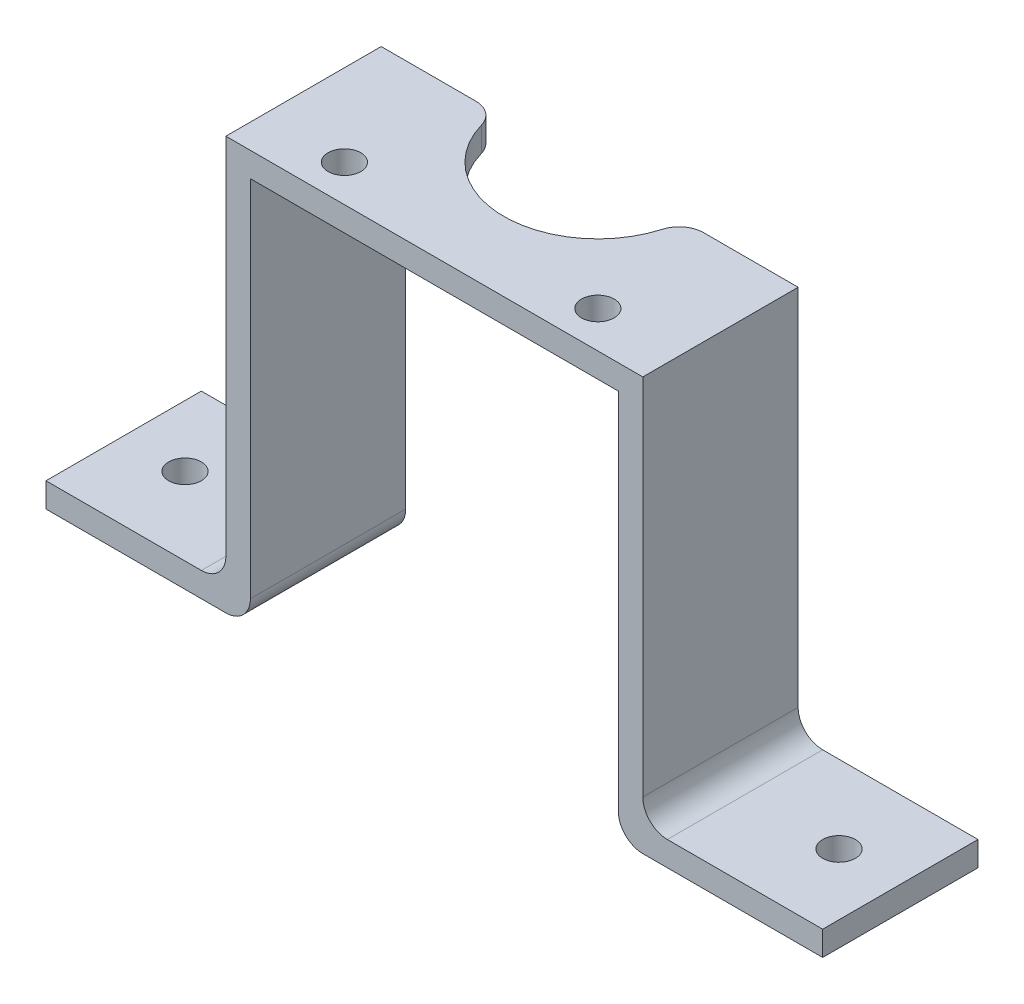
ISO-10303-21;
HEADER;
FILE_DESCRIPTION(('STEP AP214'),'2;1');
FILE_NAME('part.step','',(''),(''),'','','');
FILE_SCHEMA(('AUTOMOTIVE_DESIGN { 1 0 10303 214 1 1 1 1 }'));
ENDSEC;
DATA;
#1=APPLICATION_CONTEXT('core data for automotive mechanical design processes');
#2=APPLICATION_PROTOCOL_DEFINITION('international standard','automotive_design',2000,#1);
#3=PRODUCT_CONTEXT('',#1,'mechanical');
#4=PRODUCT('Part','Part','',(#3));
#5=PRODUCT_RELATED_PRODUCT_CATEGORY('part','',(#4));
#6=PRODUCT_DEFINITION_FORMATION('','',#4);
#7=PRODUCT_DEFINITION_CONTEXT('part definition',#1,'design');
#8=PRODUCT_DEFINITION('design','',#6,#7);
#9=PRODUCT_DEFINITION_SHAPE('','',#8);
#10=(LENGTH_UNIT() NAMED_UNIT(*) SI_UNIT(.MILLI.,.METRE.));
#11=(NAMED_UNIT(*) PLANE_ANGLE_UNIT() SI_UNIT($,.RADIAN.));
#12=(NAMED_UNIT(*) SI_UNIT($,.STERADIAN.) SOLID_ANGLE_UNIT());
#13=UNCERTAINTY_MEASURE_WITH_UNIT(LENGTH_MEASURE(1.E-05),#10,'distance_accuracy_value','');
#14=(GEOMETRIC_REPRESENTATION_CONTEXT(3) GLOBAL_UNCERTAINTY_ASSIGNED_CONTEXT((#13)) GLOBAL_UNIT_ASSIGNED_CONTEXT((#10,
#11,#12)) REPRESENTATION_CONTEXT('',''));
#15=CARTESIAN_POINT('',(0.,0.,0.));
#16=DIRECTION('',(0.,0.,1.));
#17=DIRECTION('',(1.,0.,0.));
#18=AXIS2_PLACEMENT_3D('',#15,#16,#17);
#19=CARTESIAN_POINT('',(0.,0.,-14.5));
#20=DIRECTION('',(0.,0.,1.));
#21=DIRECTION('',(1.,0.,0.));
#22=AXIS2_PLACEMENT_3D('',#19,#20,#21);
#23=PLANE('',#22);
#24=DIRECTION('',(-1.,0.,0.));
#25=VECTOR('',#24,1.);
#26=CARTESIAN_POINT('',(47.5,0.,-14.5));
#27=LINE('',#26,#25);
#28=CARTESIAN_POINT('',(47.5,0.,-14.5));
#29=VERTEX_POINT('',#28);
#30=CARTESIAN_POINT('',(25.5,0.,-14.5));
#31=VERTEX_POINT('',#30);
#32=EDGE_CURVE('E224',#29,#31,#27,.T.);
#33=ORIENTED_EDGE('',*,*,#32,.T.);
#34=CARTESIAN_POINT('',(25.5,3.,-14.5));
#35=DIRECTION('',(0.,0.,1.));
#36=DIRECTION('',(1.,0.,0.));
#37=AXIS2_PLACEMENT_3D('',#34,#35,#36);
#38=CIRCLE('',#37,3.);
#39=CARTESIAN_POINT('',(22.5,3.,-14.5));
#40=VERTEX_POINT('',#39);
#41=EDGE_CURVE('E175',#31,#40,#38,.F.);
#42=ORIENTED_EDGE('',*,*,#41,.T.);
#43=DIRECTION('',(0.,1.,0.));
#44=VECTOR('',#43,1.);
#45=CARTESIAN_POINT('',(22.5,0.,-14.5));
#46=LINE('',#45,#44);
#47=CARTESIAN_POINT('',(22.5,47.5,-14.5));
#48=VERTEX_POINT('',#47);
#49=EDGE_CURVE('E168',#40,#48,#46,.T.);
#50=ORIENTED_EDGE('',*,*,#49,.T.);
#51=DIRECTION('',(-1.,0.,0.));
#52=VECTOR('',#51,1.);
#53=CARTESIAN_POINT('',(22.5,47.5,-14.5));
#54=LINE('',#53,#52);
#55=CARTESIAN_POINT('',(13.9373598647664,47.5,-14.5));
#56=VERTEX_POINT('',#55);
#57=EDGE_CURVE('E173',#48,#56,#54,.T.);
#58=ORIENTED_EDGE('',*,*,#57,.T.);
#59=DIRECTION('',(0.,1.,0.));
#60=VECTOR('',#59,1.);
#61=CARTESIAN_POINT('',(13.9373598647663,0.,-14.5));
#62=LINE('',#61,#60);
#63=CARTESIAN_POINT('',(13.9373598647663,50.5,-14.5));
#64=VERTEX_POINT('',#63);
#65=EDGE_CURVE('E298',#56,#64,#62,.T.);
#66=ORIENTED_EDGE('',*,*,#65,.T.);
#67=DIRECTION('',(1.,0.,0.));
#68=VECTOR('',#67,1.);
#69=CARTESIAN_POINT('',(-25.5,50.5,-14.5));
#70=LINE('',#69,#68);
#71=CARTESIAN_POINT('',(25.5,50.5,-14.5));
#72=VERTEX_POINT('',#71);
#73=EDGE_CURVE('E212',#64,#72,#70,.T.);
#74=ORIENTED_EDGE('',*,*,#73,.T.);
#75=DIRECTION('',(0.,-1.,0.));
#76=VECTOR('',#75,1.);
#77=CARTESIAN_POINT('',(25.5,50.5,-14.5));
#78=LINE('',#77,#76);
#79=CARTESIAN_POINT('',(25.5,6.,-14.5));
#80=VERTEX_POINT('',#79);
#81=EDGE_CURVE('E216',#72,#80,#78,.T.);
#82=ORIENTED_EDGE('',*,*,#81,.T.);
#83=CARTESIAN_POINT('',(28.5,6.,-14.5));
#84=DIRECTION('',(0.,0.,1.));
#85=DIRECTION('',(1.,0.,0.));
#86=AXIS2_PLACEMENT_3D('',#83,#84,#85);
#87=CIRCLE('',#86,3.);
#88=CARTESIAN_POINT('',(28.5,3.,-14.5));
#89=VERTEX_POINT('',#88);
#90=EDGE_CURVE('E326',#80,#89,#87,.T.);
#91=ORIENTED_EDGE('',*,*,#90,.T.);
#92=DIRECTION('',(1.,0.,0.));
#93=VECTOR('',#92,1.);
#94=CARTESIAN_POINT('',(25.5,3.,-14.5));
#95=LINE('',#94,#93);
#96=CARTESIAN_POINT('',(47.5,3.,-14.5));
#97=VERTEX_POINT('',#96);
#98=EDGE_CURVE('E219',#89,#97,#95,.T.);
#99=ORIENTED_EDGE('',*,*,#98,.T.);
#100=DIRECTION('',(0.,-1.,0.));
#101=VECTOR('',#100,1.);
#102=CARTESIAN_POINT('',(47.5,3.,-14.5));
#103=LINE('',#102,#101);
#104=EDGE_CURVE('E221',#97,#29,#103,.T.);
#105=ORIENTED_EDGE('',*,*,#104,.T.);
#106=EDGE_LOOP('',(#33,#42,#50,#58,#66,#74,#82,#91,#99,#105));
#107=FACE_BOUND('',#106,.T.);
#108=ADVANCED_FACE('F33',(#107),#23,.F.);
#109=CARTESIAN_POINT('',(-22.5,47.5,4.5));
#110=DIRECTION('',(0.,1.,0.));
#111=DIRECTION('',(0.,0.,1.));
#112=AXIS2_PLACEMENT_3D('',#109,#110,#111);
#113=PLANE('',#112);
#114=CARTESIAN_POINT('',(15.5,47.5,0.));
#115=DIRECTION('',(0.,1.,0.));
#116=DIRECTION('',(0.,0.,1.));
#117=AXIS2_PLACEMENT_3D('',#114,#115,#116);
#118=CIRCLE('',#117,2.);
#119=CARTESIAN_POINT('',(15.5,47.5,2.));
#120=VERTEX_POINT('',#119);
#121=EDGE_CURVE('E229',#120,#120,#118,.T.);
#122=ORIENTED_EDGE('',*,*,#121,.T.);
#123=EDGE_LOOP('',(#122));
#124=FACE_BOUND('',#123,.T.);
#125=CARTESIAN_POINT('',(-15.5,47.5,0.));
#126=DIRECTION('',(0.,1.,0.));
#127=DIRECTION('',(0.,0.,1.));
#128=AXIS2_PLACEMENT_3D('',#125,#126,#127);
#129=CIRCLE('',#128,2.);
#130=CARTESIAN_POINT('',(-15.5,47.5,2.));
#131=VERTEX_POINT('',#130);
#132=EDGE_CURVE('E235',#131,#131,#129,.T.);
#133=ORIENTED_EDGE('',*,*,#132,.T.);
#134=EDGE_LOOP('',(#133));
#135=FACE_BOUND('',#134,.T.);
#136=CARTESIAN_POINT('',(-13.9373598647663,47.5,-14.5));
#137=VERTEX_POINT('',#136);
#138=CARTESIAN_POINT('',(-22.5,47.5,-14.5));
#139=VERTEX_POINT('',#138);
#140=EDGE_CURVE('E178',#137,#139,#54,.T.);
#141=ORIENTED_EDGE('',*,*,#140,.F.);
#142=CARTESIAN_POINT('',(-13.9373598647663,47.5,-11.5));
#143=DIRECTION('',(0.,1.,0.));
#144=DIRECTION('',(0.,0.,1.));
#145=AXIS2_PLACEMENT_3D('',#142,#143,#144);
#146=CIRCLE('',#145,3.);
#147=CARTESIAN_POINT('',(-11.0537681686078,47.5,-12.3275862068966));
#148=VERTEX_POINT('',#147);
#149=EDGE_CURVE('E288',#137,#148,#146,.F.);
#150=ORIENTED_EDGE('',*,*,#149,.T.);
#151=CARTESIAN_POINT('',(0.,47.5,-15.5));
#152=DIRECTION('',(0.,1.,0.));
#153=DIRECTION('',(0.,0.,1.));
#154=AXIS2_PLACEMENT_3D('',#151,#152,#153);
#155=CIRCLE('',#154,11.5);
#156=CARTESIAN_POINT('',(11.0537681686078,47.5,-12.3275862068966));
#157=VERTEX_POINT('',#156);
#158=EDGE_CURVE('E179',#148,#157,#155,.T.);
#159=ORIENTED_EDGE('',*,*,#158,.T.);
#160=CARTESIAN_POINT('',(13.9373598647663,47.5,-11.5));
#161=DIRECTION('',(0.,1.,0.));
#162=DIRECTION('',(0.,0.,1.));
#163=AXIS2_PLACEMENT_3D('',#160,#161,#162);
#164=CIRCLE('',#163,3.);
#165=EDGE_CURVE('E196',#157,#56,#164,.F.);
#166=ORIENTED_EDGE('',*,*,#165,.T.);
#167=ORIENTED_EDGE('',*,*,#57,.F.);
#168=DIRECTION('',(0.,0.,-1.));
#169=VECTOR('',#168,1.);
#170=CARTESIAN_POINT('',(22.5,47.5,4.5));
#171=LINE('',#170,#169);
#172=CARTESIAN_POINT('',(22.5,47.5,4.5));
#173=VERTEX_POINT('',#172);
#174=EDGE_CURVE('E182',#173,#48,#171,.T.);
#175=ORIENTED_EDGE('',*,*,#174,.F.);
#176=DIRECTION('',(1.,0.,0.));
#177=VECTOR('',#176,1.);
#178=CARTESIAN_POINT('',(-22.5,47.5,4.5));
#179=LINE('',#178,#177);
#180=CARTESIAN_POINT('',(-22.5,47.5,4.5));
#181=VERTEX_POINT('',#180);
#182=EDGE_CURVE('E189',#181,#173,#179,.T.);
#183=ORIENTED_EDGE('',*,*,#182,.F.);
#184=DIRECTION('',(0.,0.,-1.));
#185=VECTOR('',#184,1.);
#186=CARTESIAN_POINT('',(-22.5,47.5,4.5));
#187=LINE('',#186,#185);
#188=EDGE_CURVE('E273',#181,#139,#187,.T.);
#189=ORIENTED_EDGE('',*,*,#188,.T.);
#190=EDGE_LOOP('',(#141,#150,#159,#166,#167,#175,#183,#189));
#191=FACE_BOUND('',#190,.T.);
#192=ADVANCED_FACE('F193',(#124,#135,#191),#113,.F.);
#193=CARTESIAN_POINT('',(-22.5,50.5,4.5));
#194=DIRECTION('',(0.,1.,0.));
#195=DIRECTION('',(0.,0.,1.));
#196=AXIS2_PLACEMENT_3D('',#193,#194,#195);
#197=PLANE('',#196);
#198=CARTESIAN_POINT('',(0.,50.5,-15.5));
#199=DIRECTION('',(0.,1.,0.));
#200=DIRECTION('',(0.,0.,1.));
#201=AXIS2_PLACEMENT_3D('',#198,#199,#200);
#202=CIRCLE('',#201,11.5);
#203=CARTESIAN_POINT('',(-11.0537681686078,50.5,-12.3275862068966));
#204=VERTEX_POINT('',#203);
#205=CARTESIAN_POINT('',(11.0537681686078,50.5,-12.3275862068966));
#206=VERTEX_POINT('',#205);
#207=EDGE_CURVE('E379',#204,#206,#202,.T.);
#208=ORIENTED_EDGE('',*,*,#207,.F.);
#209=CARTESIAN_POINT('',(-13.9373598647663,50.5,-11.5));
#210=DIRECTION('',(0.,1.,0.));
#211=DIRECTION('',(0.,0.,1.));
#212=AXIS2_PLACEMENT_3D('',#209,#210,#211);
#213=CIRCLE('',#212,3.);
#214=CARTESIAN_POINT('',(-13.9373598647663,50.5,-14.5));
#215=VERTEX_POINT('',#214);
#216=EDGE_CURVE('E296',#204,#215,#213,.T.);
#217=ORIENTED_EDGE('',*,*,#216,.T.);
#218=CARTESIAN_POINT('',(-25.5,50.5,-14.5));
#219=VERTEX_POINT('',#218);
#220=EDGE_CURVE('E213',#219,#215,#70,.T.);
#221=ORIENTED_EDGE('',*,*,#220,.F.);
#222=DIRECTION('',(0.,0.,-1.));
#223=VECTOR('',#222,1.);
#224=CARTESIAN_POINT('',(-25.5,50.5,4.5));
#225=LINE('',#224,#223);
#226=CARTESIAN_POINT('',(-25.5,50.5,4.5));
#227=VERTEX_POINT('',#226);
#228=EDGE_CURVE('E281',#227,#219,#225,.T.);
#229=ORIENTED_EDGE('',*,*,#228,.F.);
#230=DIRECTION('',(1.,0.,0.));
#231=VECTOR('',#230,1.);
#232=CARTESIAN_POINT('',(-22.5,50.5,4.5));
#233=LINE('',#232,#231);
#234=CARTESIAN_POINT('',(25.5,50.5,4.5));
#235=VERTEX_POINT('',#234);
#236=EDGE_CURVE('E257',#227,#235,#233,.T.);
#237=ORIENTED_EDGE('',*,*,#236,.T.);
#238=DIRECTION('',(0.,0.,-1.));
#239=VECTOR('',#238,1.);
#240=CARTESIAN_POINT('',(25.5,50.5,4.5));
#241=LINE('',#240,#239);
#242=EDGE_CURVE('E249',#235,#72,#241,.T.);
#243=ORIENTED_EDGE('',*,*,#242,.T.);
#244=ORIENTED_EDGE('',*,*,#73,.F.);
#245=CARTESIAN_POINT('',(13.9373598647663,50.5,-11.5));
#246=DIRECTION('',(0.,1.,0.));
#247=DIRECTION('',(0.,0.,1.));
#248=AXIS2_PLACEMENT_3D('',#245,#246,#247);
#249=CIRCLE('',#248,3.);
#250=EDGE_CURVE('E294',#64,#206,#249,.T.);
#251=ORIENTED_EDGE('',*,*,#250,.T.);
#252=EDGE_LOOP('',(#208,#217,#221,#229,#237,#243,#244,#251));
#253=FACE_BOUND('',#252,.T.);
#254=CARTESIAN_POINT('',(15.5,50.5,0.));
#255=DIRECTION('',(0.,1.,0.));
#256=DIRECTION('',(0.,0.,1.));
#257=AXIS2_PLACEMENT_3D('',#254,#255,#256);
#258=CIRCLE('',#257,2.);
#259=CARTESIAN_POINT('',(15.5,50.5,2.));
#260=VERTEX_POINT('',#259);
#261=EDGE_CURVE('E226',#260,#260,#258,.T.);
#262=ORIENTED_EDGE('',*,*,#261,.F.);
#263=EDGE_LOOP('',(#262));
#264=FACE_BOUND('',#263,.T.);
#265=CARTESIAN_POINT('',(-15.5,50.5,0.));
#266=DIRECTION('',(0.,1.,0.));
#267=DIRECTION('',(0.,0.,1.));
#268=AXIS2_PLACEMENT_3D('',#265,#266,#267);
#269=CIRCLE('',#268,2.);
#270=CARTESIAN_POINT('',(-15.5,50.5,2.));
#271=VERTEX_POINT('',#270);
#272=EDGE_CURVE('E232',#271,#271,#269,.T.);
#273=ORIENTED_EDGE('',*,*,#272,.F.);
#274=EDGE_LOOP('',(#273));
#275=FACE_BOUND('',#274,.T.);
#276=ADVANCED_FACE('F421',(#253,#264,#275),#197,.T.);
#277=CARTESIAN_POINT('',(-25.5,0.,4.5));
#278=DIRECTION('',(-1.,0.,0.));
#279=DIRECTION('',(0.,-1.,0.));
#280=AXIS2_PLACEMENT_3D('',#277,#278,#279);
#281=PLANE('',#280);
#282=DIRECTION('',(0.,1.,0.));
#283=VECTOR('',#282,1.);
#284=CARTESIAN_POINT('',(-25.5,3.,-14.5));
#285=LINE('',#284,#283);
#286=CARTESIAN_POINT('',(-25.5,6.,-14.5));
#287=VERTEX_POINT('',#286);
#288=EDGE_CURVE('E210',#287,#219,#285,.T.);
#289=ORIENTED_EDGE('',*,*,#288,.F.);
#290=DIRECTION('',(0.,0.,-1.));
#291=VECTOR('',#290,1.);
#292=CARTESIAN_POINT('',(-25.5,6.,4.5));
#293=LINE('',#292,#291);
#294=CARTESIAN_POINT('',(-25.5,6.,4.5));
#295=VERTEX_POINT('',#294);
#296=EDGE_CURVE('E324',#287,#295,#293,.F.);
#297=ORIENTED_EDGE('',*,*,#296,.T.);
#298=DIRECTION('',(0.,1.,0.));
#299=VECTOR('',#298,1.);
#300=CARTESIAN_POINT('',(-25.5,0.,4.5));
#301=LINE('',#300,#299);
#302=EDGE_CURVE('E260',#295,#227,#301,.T.);
#303=ORIENTED_EDGE('',*,*,#302,.T.);
#304=ORIENTED_EDGE('',*,*,#228,.T.);
#305=EDGE_LOOP('',(#289,#297,#303,#304));
#306=FACE_BOUND('',#305,.T.);
#307=ADVANCED_FACE('F449',(#306),#281,.T.);
#308=CARTESIAN_POINT('',(-47.5,3.,4.5));
#309=DIRECTION('',(0.,1.,0.));
#310=DIRECTION('',(0.,0.,1.));
#311=AXIS2_PLACEMENT_3D('',#308,#309,#310);
#312=PLANE('',#311);
#313=CARTESIAN_POINT('',(-40.,3.,-5.));
#314=DIRECTION('',(0.,1.,0.));
#315=DIRECTION('',(0.,0.,1.));
#316=AXIS2_PLACEMENT_3D('',#313,#314,#315);
#317=CIRCLE('',#316,2.);
#318=CARTESIAN_POINT('',(-40.,3.,-3.));
#319=VERTEX_POINT('',#318);
#320=EDGE_CURVE('E383',#319,#319,#317,.T.);
#321=ORIENTED_EDGE('',*,*,#320,.F.);
#322=EDGE_LOOP('',(#321));
#323=FACE_BOUND('',#322,.T.);
#324=DIRECTION('',(1.,0.,0.));
#325=VECTOR('',#324,1.);
#326=CARTESIAN_POINT('',(-47.5,3.,4.5));
#327=LINE('',#326,#325);
#328=CARTESIAN_POINT('',(-47.5,3.,4.5));
#329=VERTEX_POINT('',#328);
#330=CARTESIAN_POINT('',(-28.5,3.,4.5));
#331=VERTEX_POINT('',#330);
#332=EDGE_CURVE('E262',#329,#331,#327,.T.);
#333=ORIENTED_EDGE('',*,*,#332,.T.);
#334=DIRECTION('',(0.,0.,-1.));
#335=VECTOR('',#334,1.);
#336=CARTESIAN_POINT('',(-28.5,3.,-14.5));
#337=LINE('',#336,#335);
#338=CARTESIAN_POINT('',(-28.5,3.,-14.5));
#339=VERTEX_POINT('',#338);
#340=EDGE_CURVE('E322',#331,#339,#337,.T.);
#341=ORIENTED_EDGE('',*,*,#340,.T.);
#342=DIRECTION('',(1.,0.,0.));
#343=VECTOR('',#342,1.);
#344=CARTESIAN_POINT('',(-47.5,3.,-14.5));
#345=LINE('',#344,#343);
#346=CARTESIAN_POINT('',(-47.5,3.,-14.5));
#347=VERTEX_POINT('',#346);
#348=EDGE_CURVE('E208',#347,#339,#345,.T.);
#349=ORIENTED_EDGE('',*,*,#348,.F.);
#350=DIRECTION('',(0.,0.,-1.));
#351=VECTOR('',#350,1.);
#352=CARTESIAN_POINT('',(-47.5,3.,4.5));
#353=LINE('',#352,#351);
#354=EDGE_CURVE('E279',#329,#347,#353,.T.);
#355=ORIENTED_EDGE('',*,*,#354,.F.);
#356=EDGE_LOOP('',(#333,#341,#349,#355));
#357=FACE_BOUND('',#356,.T.);
#358=ADVANCED_FACE('F456',(#323,#357),#312,.T.);
#359=CARTESIAN_POINT('',(-47.5,0.,4.5));
#360=DIRECTION('',(-1.,0.,0.));
#361=DIRECTION('',(0.,0.,1.));
#362=AXIS2_PLACEMENT_3D('',#359,#360,#361);
#363=PLANE('',#362);
#364=ORIENTED_EDGE('',*,*,#354,.T.);
#365=DIRECTION('',(0.,1.,0.));
#366=VECTOR('',#365,1.);
#367=CARTESIAN_POINT('',(-47.5,0.,-14.5));
#368=LINE('',#367,#366);
#369=CARTESIAN_POINT('',(-47.5,0.,-14.5));
#370=VERTEX_POINT('',#369);
#371=EDGE_CURVE('E205',#370,#347,#368,.T.);
#372=ORIENTED_EDGE('',*,*,#371,.F.);
#373=DIRECTION('',(0.,0.,-1.));
#374=VECTOR('',#373,1.);
#375=CARTESIAN_POINT('',(-47.5,0.,4.5));
#376=LINE('',#375,#374);
#377=CARTESIAN_POINT('',(-47.5,0.,4.5));
#378=VERTEX_POINT('',#377);
#379=EDGE_CURVE('E276',#378,#370,#376,.T.);
#380=ORIENTED_EDGE('',*,*,#379,.F.);
#381=DIRECTION('',(0.,1.,0.));
#382=VECTOR('',#381,1.);
#383=CARTESIAN_POINT('',(-47.5,0.,4.5));
#384=LINE('',#383,#382);
#385=EDGE_CURVE('E265',#378,#329,#384,.T.);
#386=ORIENTED_EDGE('',*,*,#385,.T.);
#387=EDGE_LOOP('',(#364,#372,#380,#386));
#388=FACE_BOUND('',#387,.T.);
#389=ADVANCED_FACE('F491',(#388),#363,.T.);
#390=CARTESIAN_POINT('',(-47.5,0.,4.5));
#391=DIRECTION('',(0.,1.,0.));
#392=DIRECTION('',(0.,0.,1.));
#393=AXIS2_PLACEMENT_3D('',#390,#391,#392);
#394=PLANE('',#393);
#395=CARTESIAN_POINT('',(-40.,0.,-5.));
#396=DIRECTION('',(0.,1.,0.));
#397=DIRECTION('',(0.,0.,1.));
#398=AXIS2_PLACEMENT_3D('',#395,#396,#397);
#399=CIRCLE('',#398,2.);
#400=CARTESIAN_POINT('',(-40.,0.,-3.));
#401=VERTEX_POINT('',#400);
#402=EDGE_CURVE('E380',#401,#401,#399,.T.);
#403=ORIENTED_EDGE('',*,*,#402,.T.);
#404=EDGE_LOOP('',(#403));
#405=FACE_BOUND('',#404,.T.);
#406=DIRECTION('',(-1.,0.,0.));
#407=VECTOR('',#406,1.);
#408=CARTESIAN_POINT('',(-22.5,0.,-14.5));
#409=LINE('',#408,#407);
#410=CARTESIAN_POINT('',(-25.5,0.,-14.5));
#411=VERTEX_POINT('',#410);
#412=EDGE_CURVE('E200',#411,#370,#409,.T.);
#413=ORIENTED_EDGE('',*,*,#412,.F.);
#414=DIRECTION('',(0.,0.,-1.));
#415=VECTOR('',#414,1.);
#416=CARTESIAN_POINT('',(-25.5,0.,4.5));
#417=LINE('',#416,#415);
#418=CARTESIAN_POINT('',(-25.5,0.,4.5));
#419=VERTEX_POINT('',#418);
#420=EDGE_CURVE('E320',#411,#419,#417,.F.);
#421=ORIENTED_EDGE('',*,*,#420,.T.);
#422=DIRECTION('',(1.,0.,0.));
#423=VECTOR('',#422,1.);
#424=CARTESIAN_POINT('',(-47.5,0.,4.5));
#425=LINE('',#424,#423);
#426=EDGE_CURVE('E268',#378,#419,#425,.T.);
#427=ORIENTED_EDGE('',*,*,#426,.F.);
#428=ORIENTED_EDGE('',*,*,#379,.T.);
#429=EDGE_LOOP('',(#413,#421,#427,#428));
#430=FACE_BOUND('',#429,.T.);
#431=ADVANCED_FACE('F482',(#405,#430),#394,.F.);
#432=CARTESIAN_POINT('',(-22.5,0.,4.5));
#433=DIRECTION('',(-1.,0.,0.));
#434=DIRECTION('',(0.,-1.,0.));
#435=AXIS2_PLACEMENT_3D('',#432,#433,#434);
#436=PLANE('',#435);
#437=DIRECTION('',(0.,1.,0.));
#438=VECTOR('',#437,1.);
#439=CARTESIAN_POINT('',(-22.5,0.,4.5));
#440=LINE('',#439,#438);
#441=CARTESIAN_POINT('',(-22.5,3.,4.5));
#442=VERTEX_POINT('',#441);
#443=EDGE_CURVE('E271',#442,#181,#440,.T.);
#444=ORIENTED_EDGE('',*,*,#443,.F.);
#445=DIRECTION('',(0.,0.,-1.));
#446=VECTOR('',#445,1.);
#447=CARTESIAN_POINT('',(-22.5,3.,4.5));
#448=LINE('',#447,#446);
#449=CARTESIAN_POINT('',(-22.5,3.,-14.5));
#450=VERTEX_POINT('',#449);
#451=EDGE_CURVE('E315',#442,#450,#448,.T.);
#452=ORIENTED_EDGE('',*,*,#451,.T.);
#453=DIRECTION('',(0.,-1.,0.));
#454=VECTOR('',#453,1.);
#455=CARTESIAN_POINT('',(-22.5,47.5,-14.5));
#456=LINE('',#455,#454);
#457=EDGE_CURVE('E197',#139,#450,#456,.T.);
#458=ORIENTED_EDGE('',*,*,#457,.F.);
#459=ORIENTED_EDGE('',*,*,#188,.F.);
#460=EDGE_LOOP('',(#444,#452,#458,#459));
#461=FACE_BOUND('',#460,.T.);
#462=ADVANCED_FACE('F363',(#461),#436,.F.);
#463=CARTESIAN_POINT('',(0.,0.,4.5));
#464=DIRECTION('',(0.,0.,-1.));
#465=DIRECTION('',(-1.,0.,0.));
#466=AXIS2_PLACEMENT_3D('',#463,#464,#465);
#467=PLANE('',#466);
#468=DIRECTION('',(0.,1.,0.));
#469=VECTOR('',#468,1.);
#470=CARTESIAN_POINT('',(22.5,0.,4.5));
#471=LINE('',#470,#469);
#472=CARTESIAN_POINT('',(22.5,3.,4.5));
#473=VERTEX_POINT('',#472);
#474=EDGE_CURVE('E185',#473,#173,#471,.T.);
#475=ORIENTED_EDGE('',*,*,#474,.F.);
#476=CARTESIAN_POINT('',(25.5,3.,4.5));
#477=DIRECTION('',(0.,0.,-1.));
#478=DIRECTION('',(-1.,0.,0.));
#479=AXIS2_PLACEMENT_3D('',#476,#477,#478);
#480=CIRCLE('',#479,3.);
#481=CARTESIAN_POINT('',(25.5,0.,4.5));
#482=VERTEX_POINT('',#481);
#483=EDGE_CURVE('E313',#473,#482,#480,.F.);
#484=ORIENTED_EDGE('',*,*,#483,.T.);
#485=DIRECTION('',(-1.,0.,0.));
#486=VECTOR('',#485,1.);
#487=CARTESIAN_POINT('',(47.5,0.,4.5));
#488=LINE('',#487,#486);
#489=CARTESIAN_POINT('',(47.5,0.,4.5));
#490=VERTEX_POINT('',#489);
#491=EDGE_CURVE('E239',#490,#482,#488,.T.);
#492=ORIENTED_EDGE('',*,*,#491,.F.);
#493=DIRECTION('',(0.,1.,0.));
#494=VECTOR('',#493,1.);
#495=CARTESIAN_POINT('',(47.5,0.,4.5));
#496=LINE('',#495,#494);
#497=CARTESIAN_POINT('',(47.5,3.,4.5));
#498=VERTEX_POINT('',#497);
#499=EDGE_CURVE('E242',#490,#498,#496,.T.);
#500=ORIENTED_EDGE('',*,*,#499,.T.);
#501=DIRECTION('',(-1.,0.,0.));
#502=VECTOR('',#501,1.);
#503=CARTESIAN_POINT('',(47.5,3.,4.5));
#504=LINE('',#503,#502);
#505=CARTESIAN_POINT('',(28.5,3.,4.5));
#506=VERTEX_POINT('',#505);
#507=EDGE_CURVE('E244',#498,#506,#504,.T.);
#508=ORIENTED_EDGE('',*,*,#507,.T.);
#509=CARTESIAN_POINT('',(28.5,6.,4.5));
#510=DIRECTION('',(0.,0.,-1.));
#511=DIRECTION('',(-1.,0.,0.));
#512=AXIS2_PLACEMENT_3D('',#509,#510,#511);
#513=CIRCLE('',#512,3.);
#514=CARTESIAN_POINT('',(25.5,6.,4.5));
#515=VERTEX_POINT('',#514);
#516=EDGE_CURVE('E328',#506,#515,#513,.T.);
#517=ORIENTED_EDGE('',*,*,#516,.T.);
#518=DIRECTION('',(0.,1.,0.));
#519=VECTOR('',#518,1.);
#520=CARTESIAN_POINT('',(25.5,0.,4.5));
#521=LINE('',#520,#519);
#522=EDGE_CURVE('E247',#515,#235,#521,.T.);
#523=ORIENTED_EDGE('',*,*,#522,.T.);
#524=ORIENTED_EDGE('',*,*,#236,.F.);
#525=ORIENTED_EDGE('',*,*,#302,.F.);
#526=CARTESIAN_POINT('',(-28.5,6.,4.5));
#527=DIRECTION('',(0.,0.,-1.));
#528=DIRECTION('',(-1.,0.,0.));
#529=AXIS2_PLACEMENT_3D('',#526,#527,#528);
#530=CIRCLE('',#529,3.);
#531=EDGE_CURVE('E11',#295,#331,#530,.T.);
#532=ORIENTED_EDGE('',*,*,#531,.T.);
#533=ORIENTED_EDGE('',*,*,#332,.F.);
#534=ORIENTED_EDGE('',*,*,#385,.F.);
#535=ORIENTED_EDGE('',*,*,#426,.T.);
#536=CARTESIAN_POINT('',(-25.5,3.,4.5));
#537=DIRECTION('',(0.,0.,-1.));
#538=DIRECTION('',(-1.,0.,0.));
#539=AXIS2_PLACEMENT_3D('',#536,#537,#538);
#540=CIRCLE('',#539,3.);
#541=EDGE_CURVE('E311',#419,#442,#540,.F.);
#542=ORIENTED_EDGE('',*,*,#541,.T.);
#543=ORIENTED_EDGE('',*,*,#443,.T.);
#544=ORIENTED_EDGE('',*,*,#182,.T.);
#545=EDGE_LOOP('',(#475,#484,#492,#500,#508,#517,#523,#524,#525,#532,#533,#534,#535,#542,#543,#544));
#546=FACE_BOUND('',#545,.T.);
#547=ADVANCED_FACE('F332',(#546),#467,.F.);
#548=CARTESIAN_POINT('',(22.5,0.,4.5));
#549=DIRECTION('',(-1.,0.,0.));
#550=DIRECTION('',(0.,-1.,0.));
#551=AXIS2_PLACEMENT_3D('',#548,#549,#550);
#552=PLANE('',#551);
#553=ORIENTED_EDGE('',*,*,#49,.F.);
#554=DIRECTION('',(0.,0.,-1.));
#555=VECTOR('',#554,1.);
#556=CARTESIAN_POINT('',(22.5,3.,4.5));
#557=LINE('',#556,#555);
#558=EDGE_CURVE('E309',#40,#473,#557,.F.);
#559=ORIENTED_EDGE('',*,*,#558,.T.);
#560=ORIENTED_EDGE('',*,*,#474,.T.);
#561=ORIENTED_EDGE('',*,*,#174,.T.);
#562=EDGE_LOOP('',(#553,#559,#560,#561));
#563=FACE_BOUND('',#562,.T.);
#564=ADVANCED_FACE('F183',(#563),#552,.T.);
#565=CARTESIAN_POINT('',(47.5,0.,4.5));
#566=DIRECTION('',(0.,-1.,0.));
#567=DIRECTION('',(0.,0.,-1.));
#568=AXIS2_PLACEMENT_3D('',#565,#566,#567);
#569=PLANE('',#568);
#570=CARTESIAN_POINT('',(40.,0.,-5.));
#571=DIRECTION('',(0.,1.,0.));
#572=DIRECTION('',(0.,0.,1.));
#573=AXIS2_PLACEMENT_3D('',#570,#571,#572);
#574=CIRCLE('',#573,2.);
#575=CARTESIAN_POINT('',(40.,0.,-3.));
#576=VERTEX_POINT('',#575);
#577=EDGE_CURVE('E386',#576,#576,#574,.T.);
#578=ORIENTED_EDGE('',*,*,#577,.T.);
#579=EDGE_LOOP('',(#578));
#580=FACE_BOUND('',#579,.T.);
#581=ORIENTED_EDGE('',*,*,#491,.T.);
#582=DIRECTION('',(0.,0.,-1.));
#583=VECTOR('',#582,1.);
#584=CARTESIAN_POINT('',(25.5,0.,4.5));
#585=LINE('',#584,#583);
#586=EDGE_CURVE('E305',#482,#31,#585,.T.);
#587=ORIENTED_EDGE('',*,*,#586,.T.);
#588=ORIENTED_EDGE('',*,*,#32,.F.);
#589=DIRECTION('',(0.,0.,-1.));
#590=VECTOR('',#589,1.);
#591=CARTESIAN_POINT('',(47.5,0.,4.5));
#592=LINE('',#591,#590);
#593=EDGE_CURVE('E190',#490,#29,#592,.T.);
#594=ORIENTED_EDGE('',*,*,#593,.F.);
#595=EDGE_LOOP('',(#581,#587,#588,#594));
#596=FACE_BOUND('',#595,.T.);
#597=ADVANCED_FACE('F353',(#580,#596),#569,.T.);
#598=CARTESIAN_POINT('',(47.5,0.,4.5));
#599=DIRECTION('',(-1.,0.,0.));
#600=DIRECTION('',(0.,0.,1.));
#601=AXIS2_PLACEMENT_3D('',#598,#599,#600);
#602=PLANE('',#601);
#603=ORIENTED_EDGE('',*,*,#593,.T.);
#604=ORIENTED_EDGE('',*,*,#104,.F.);
#605=DIRECTION('',(0.,0.,-1.));
#606=VECTOR('',#605,1.);
#607=CARTESIAN_POINT('',(47.5,3.,4.5));
#608=LINE('',#607,#606);
#609=EDGE_CURVE('E252',#498,#97,#608,.T.);
#610=ORIENTED_EDGE('',*,*,#609,.F.);
#611=ORIENTED_EDGE('',*,*,#499,.F.);
#612=EDGE_LOOP('',(#603,#604,#610,#611));
#613=FACE_BOUND('',#612,.T.);
#614=ADVANCED_FACE('F350',(#613),#602,.F.);
#615=CARTESIAN_POINT('',(47.5,3.,4.5));
#616=DIRECTION('',(0.,-1.,0.));
#617=DIRECTION('',(0.,0.,-1.));
#618=AXIS2_PLACEMENT_3D('',#615,#616,#617);
#619=PLANE('',#618);
#620=CARTESIAN_POINT('',(40.,3.,-5.));
#621=DIRECTION('',(0.,1.,0.));
#622=DIRECTION('',(0.,0.,1.));
#623=AXIS2_PLACEMENT_3D('',#620,#621,#622);
#624=CIRCLE('',#623,2.);
#625=CARTESIAN_POINT('',(40.,3.,-3.));
#626=VERTEX_POINT('',#625);
#627=EDGE_CURVE('E389',#626,#626,#624,.T.);
#628=ORIENTED_EDGE('',*,*,#627,.F.);
#629=EDGE_LOOP('',(#628));
#630=FACE_BOUND('',#629,.T.);
#631=ORIENTED_EDGE('',*,*,#98,.F.);
#632=DIRECTION('',(0.,0.,-1.));
#633=VECTOR('',#632,1.);
#634=CARTESIAN_POINT('',(28.5,3.,4.5));
#635=LINE('',#634,#633);
#636=EDGE_CURVE('E303',#89,#506,#635,.F.);
#637=ORIENTED_EDGE('',*,*,#636,.T.);
#638=ORIENTED_EDGE('',*,*,#507,.F.);
#639=ORIENTED_EDGE('',*,*,#609,.T.);
#640=EDGE_LOOP('',(#631,#637,#638,#639));
#641=FACE_BOUND('',#640,.T.);
#642=ADVANCED_FACE('F345',(#630,#641),#619,.F.);
#643=CARTESIAN_POINT('',(25.5,0.,4.5));
#644=DIRECTION('',(-1.,0.,0.));
#645=DIRECTION('',(0.,-1.,0.));
#646=AXIS2_PLACEMENT_3D('',#643,#644,#645);
#647=PLANE('',#646);
#648=ORIENTED_EDGE('',*,*,#522,.F.);
#649=DIRECTION('',(0.,0.,-1.));
#650=VECTOR('',#649,1.);
#651=CARTESIAN_POINT('',(25.5,6.,-14.5));
#652=LINE('',#651,#650);
#653=EDGE_CURVE('E300',#515,#80,#652,.T.);
#654=ORIENTED_EDGE('',*,*,#653,.T.);
#655=ORIENTED_EDGE('',*,*,#81,.F.);
#656=ORIENTED_EDGE('',*,*,#242,.F.);
#657=EDGE_LOOP('',(#648,#654,#655,#656));
#658=FACE_BOUND('',#657,.T.);
#659=ADVANCED_FACE('F340',(#658),#647,.F.);
#660=CARTESIAN_POINT('',(-15.5,0.,0.));
#661=DIRECTION('',(0.,1.,0.));
#662=DIRECTION('',(0.,0.,1.));
#663=AXIS2_PLACEMENT_3D('',#660,#661,#662);
#664=CYLINDRICAL_SURFACE('',#663,2.);
#665=ORIENTED_EDGE('',*,*,#272,.T.);
#666=EDGE_LOOP('',(#665));
#667=FACE_BOUND('',#666,.T.);
#668=ORIENTED_EDGE('',*,*,#132,.F.);
#669=EDGE_LOOP('',(#668));
#670=FACE_BOUND('',#669,.T.);
#671=ADVANCED_FACE('F410',(#667,#670),#664,.F.);
#672=CARTESIAN_POINT('',(15.5,0.,0.));
#673=DIRECTION('',(0.,1.,0.));
#674=DIRECTION('',(0.,0.,1.));
#675=AXIS2_PLACEMENT_3D('',#672,#673,#674);
#676=CYLINDRICAL_SURFACE('',#675,2.);
#677=ORIENTED_EDGE('',*,*,#261,.T.);
#678=EDGE_LOOP('',(#677));
#679=FACE_BOUND('',#678,.T.);
#680=ORIENTED_EDGE('',*,*,#121,.F.);
#681=EDGE_LOOP('',(#680));
#682=FACE_BOUND('',#681,.T.);
#683=ADVANCED_FACE('F427',(#679,#682),#676,.F.);
#684=ORIENTED_EDGE('',*,*,#457,.T.);
#685=CARTESIAN_POINT('',(-25.5,3.,-14.5));
#686=DIRECTION('',(0.,0.,1.));
#687=DIRECTION('',(1.,0.,0.));
#688=AXIS2_PLACEMENT_3D('',#685,#686,#687);
#689=CIRCLE('',#688,3.);
#690=EDGE_CURVE('E318',#450,#411,#689,.F.);
#691=ORIENTED_EDGE('',*,*,#690,.T.);
#692=ORIENTED_EDGE('',*,*,#412,.T.);
#693=ORIENTED_EDGE('',*,*,#371,.T.);
#694=ORIENTED_EDGE('',*,*,#348,.T.);
#695=CARTESIAN_POINT('',(-28.5,6.,-14.5));
#696=DIRECTION('',(0.,0.,1.));
#697=DIRECTION('',(1.,0.,0.));
#698=AXIS2_PLACEMENT_3D('',#695,#696,#697);
#699=CIRCLE('',#698,3.);
#700=EDGE_CURVE('E41',#339,#287,#699,.T.);
#701=ORIENTED_EDGE('',*,*,#700,.T.);
#702=ORIENTED_EDGE('',*,*,#288,.T.);
#703=ORIENTED_EDGE('',*,*,#220,.T.);
#704=DIRECTION('',(0.,1.,0.));
#705=VECTOR('',#704,1.);
#706=CARTESIAN_POINT('',(-13.9373598647663,0.,-14.5));
#707=LINE('',#706,#705);
#708=EDGE_CURVE('E284',#215,#137,#707,.F.);
#709=ORIENTED_EDGE('',*,*,#708,.T.);
#710=ORIENTED_EDGE('',*,*,#140,.T.);
#711=EDGE_LOOP('',(#684,#691,#692,#693,#694,#701,#702,#703,#709,#710));
#712=FACE_BOUND('',#711,.T.);
#713=ADVANCED_FACE('F365',(#712),#23,.F.);
#714=CARTESIAN_POINT('',(0.,0.,-15.5));
#715=DIRECTION('',(0.,1.,0.));
#716=DIRECTION('',(0.,0.,1.));
#717=AXIS2_PLACEMENT_3D('',#714,#715,#716);
#718=CYLINDRICAL_SURFACE('',#717,11.5);
#719=ORIENTED_EDGE('',*,*,#158,.F.);
#720=DIRECTION('',(0.,1.,0.));
#721=VECTOR('',#720,1.);
#722=CARTESIAN_POINT('',(-11.0537681686078,0.,-12.3275862068966));
#723=LINE('',#722,#721);
#724=EDGE_CURVE('E292',#148,#204,#723,.T.);
#725=ORIENTED_EDGE('',*,*,#724,.T.);
#726=ORIENTED_EDGE('',*,*,#207,.T.);
#727=DIRECTION('',(0.,1.,0.));
#728=VECTOR('',#727,1.);
#729=CARTESIAN_POINT('',(11.0537681686078,0.,-12.3275862068966));
#730=LINE('',#729,#728);
#731=EDGE_CURVE('E290',#206,#157,#730,.F.);
#732=ORIENTED_EDGE('',*,*,#731,.T.);
#733=EDGE_LOOP('',(#719,#725,#726,#732));
#734=FACE_BOUND('',#733,.T.);
#735=ADVANCED_FACE('F375',(#734),#718,.F.);
#736=CARTESIAN_POINT('',(-13.9373598647663,0.,-11.5));
#737=DIRECTION('',(0.,1.,0.));
#738=DIRECTION('',(0.,0.,1.));
#739=AXIS2_PLACEMENT_3D('',#736,#737,#738);
#740=CYLINDRICAL_SURFACE('',#739,3.);
#741=ORIENTED_EDGE('',*,*,#216,.F.);
#742=ORIENTED_EDGE('',*,*,#724,.F.);
#743=ORIENTED_EDGE('',*,*,#149,.F.);
#744=ORIENTED_EDGE('',*,*,#708,.F.);
#745=EDGE_LOOP('',(#741,#742,#743,#744));
#746=FACE_BOUND('',#745,.T.);
#747=ADVANCED_FACE('F371',(#746),#740,.T.);
#748=CARTESIAN_POINT('',(13.9373598647663,0.,-11.5));
#749=DIRECTION('',(0.,1.,0.));
#750=DIRECTION('',(0.,0.,1.));
#751=AXIS2_PLACEMENT_3D('',#748,#749,#750);
#752=CYLINDRICAL_SURFACE('',#751,3.);
#753=ORIENTED_EDGE('',*,*,#165,.F.);
#754=ORIENTED_EDGE('',*,*,#731,.F.);
#755=ORIENTED_EDGE('',*,*,#250,.F.);
#756=ORIENTED_EDGE('',*,*,#65,.F.);
#757=EDGE_LOOP('',(#753,#754,#755,#756));
#758=FACE_BOUND('',#757,.T.);
#759=ADVANCED_FACE('F463',(#758),#752,.T.);
#760=CARTESIAN_POINT('',(28.5,6.,4.5));
#761=DIRECTION('',(0.,0.,1.));
#762=DIRECTION('',(1.,0.,0.));
#763=AXIS2_PLACEMENT_3D('',#760,#761,#762);
#764=CYLINDRICAL_SURFACE('',#763,3.);
#765=ORIENTED_EDGE('',*,*,#516,.F.);
#766=ORIENTED_EDGE('',*,*,#636,.F.);
#767=ORIENTED_EDGE('',*,*,#90,.F.);
#768=ORIENTED_EDGE('',*,*,#653,.F.);
#769=EDGE_LOOP('',(#765,#766,#767,#768));
#770=FACE_BOUND('',#769,.T.);
#771=ADVANCED_FACE('F342',(#770),#764,.F.);
#772=CARTESIAN_POINT('',(25.5,3.,4.5));
#773=DIRECTION('',(0.,0.,-1.));
#774=DIRECTION('',(-1.,0.,0.));
#775=AXIS2_PLACEMENT_3D('',#772,#773,#774);
#776=CYLINDRICAL_SURFACE('',#775,3.);
#777=ORIENTED_EDGE('',*,*,#483,.F.);
#778=ORIENTED_EDGE('',*,*,#558,.F.);
#779=ORIENTED_EDGE('',*,*,#41,.F.);
#780=ORIENTED_EDGE('',*,*,#586,.F.);
#781=EDGE_LOOP('',(#777,#778,#779,#780));
#782=FACE_BOUND('',#781,.T.);
#783=ADVANCED_FACE('F358',(#782),#776,.T.);
#784=CARTESIAN_POINT('',(-25.5,3.,4.5));
#785=DIRECTION('',(0.,0.,-1.));
#786=DIRECTION('',(-1.,0.,0.));
#787=AXIS2_PLACEMENT_3D('',#784,#785,#786);
#788=CYLINDRICAL_SURFACE('',#787,3.);
#789=ORIENTED_EDGE('',*,*,#541,.F.);
#790=ORIENTED_EDGE('',*,*,#420,.F.);
#791=ORIENTED_EDGE('',*,*,#690,.F.);
#792=ORIENTED_EDGE('',*,*,#451,.F.);
#793=EDGE_LOOP('',(#789,#790,#791,#792));
#794=FACE_BOUND('',#793,.T.);
#795=ADVANCED_FACE('F470',(#794),#788,.T.);
#796=CARTESIAN_POINT('',(-28.5,6.,4.5));
#797=DIRECTION('',(0.,0.,1.));
#798=DIRECTION('',(1.,0.,0.));
#799=AXIS2_PLACEMENT_3D('',#796,#797,#798);
#800=CYLINDRICAL_SURFACE('',#799,3.);
#801=ORIENTED_EDGE('',*,*,#531,.F.);
#802=ORIENTED_EDGE('',*,*,#296,.F.);
#803=ORIENTED_EDGE('',*,*,#700,.F.);
#804=ORIENTED_EDGE('',*,*,#340,.F.);
#805=EDGE_LOOP('',(#801,#802,#803,#804));
#806=FACE_BOUND('',#805,.T.);
#807=ADVANCED_FACE('F35',(#806),#800,.F.);
#808=CARTESIAN_POINT('',(-40.,0.,-5.));
#809=DIRECTION('',(0.,1.,0.));
#810=DIRECTION('',(0.,0.,1.));
#811=AXIS2_PLACEMENT_3D('',#808,#809,#810);
#812=CYLINDRICAL_SURFACE('',#811,2.);
#813=ORIENTED_EDGE('',*,*,#402,.F.);
#814=EDGE_LOOP('',(#813));
#815=FACE_BOUND('',#814,.T.);
#816=ORIENTED_EDGE('',*,*,#320,.T.);
#817=EDGE_LOOP('',(#816));
#818=FACE_BOUND('',#817,.T.);
#819=ADVANCED_FACE('F399',(#815,#818),#812,.F.);
#820=CARTESIAN_POINT('',(40.,0.,-5.));
#821=DIRECTION('',(0.,1.,0.));
#822=DIRECTION('',(0.,0.,1.));
#823=AXIS2_PLACEMENT_3D('',#820,#821,#822);
#824=CYLINDRICAL_SURFACE('',#823,2.);
#825=ORIENTED_EDGE('',*,*,#577,.F.);
#826=EDGE_LOOP('',(#825));
#827=FACE_BOUND('',#826,.T.);
#828=ORIENTED_EDGE('',*,*,#627,.T.);
#829=EDGE_LOOP('',(#828));
#830=FACE_BOUND('',#829,.T.);
#831=ADVANCED_FACE('F396',(#827,#830),#824,.F.);
#832=CLOSED_SHELL('',(#108,#192,#276,#307,#358,#389,#431,#462,#547,#564,#597,#614,#642,#659,
#671,#683,#713,#735,#747,#759,#771,#783,#795,#807,#819,#831));
#833=MANIFOLD_SOLID_BREP('B2',#832);
#834=ADVANCED_BREP_SHAPE_REPRESENTATION('',(#18,#833),#14);
#835=SHAPE_DEFINITION_REPRESENTATION(#9,#834);
ENDSEC;
END-ISO-10303-21;
